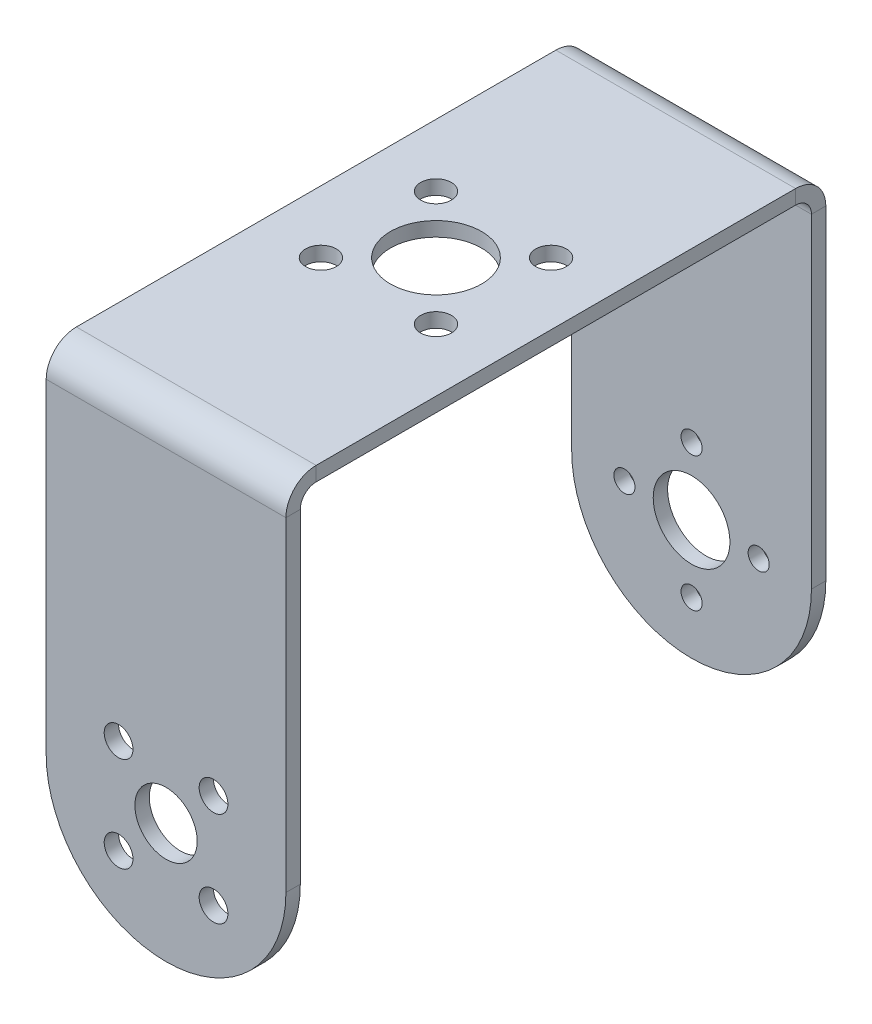
ISO-10303-21;
HEADER;
FILE_DESCRIPTION(('STEP AP214'),'2;1');
FILE_NAME('part.step','',(''),(''),'','','');
FILE_SCHEMA(('AUTOMOTIVE_DESIGN { 1 0 10303 214 1 1 1 1 }'));
ENDSEC;
DATA;
#1=APPLICATION_CONTEXT('core data for automotive mechanical design processes');
#2=APPLICATION_PROTOCOL_DEFINITION('international standard','automotive_design',2000,#1);
#3=PRODUCT_CONTEXT('',#1,'mechanical');
#4=PRODUCT('Part','Part','',(#3));
#5=PRODUCT_RELATED_PRODUCT_CATEGORY('part','',(#4));
#6=PRODUCT_DEFINITION_FORMATION('','',#4);
#7=PRODUCT_DEFINITION_CONTEXT('part definition',#1,'design');
#8=PRODUCT_DEFINITION('design','',#6,#7);
#9=PRODUCT_DEFINITION_SHAPE('','',#8);
#10=(LENGTH_UNIT() NAMED_UNIT(*) SI_UNIT(.MILLI.,.METRE.));
#11=(NAMED_UNIT(*) PLANE_ANGLE_UNIT() SI_UNIT($,.RADIAN.));
#12=(NAMED_UNIT(*) SI_UNIT($,.STERADIAN.) SOLID_ANGLE_UNIT());
#13=UNCERTAINTY_MEASURE_WITH_UNIT(LENGTH_MEASURE(1.E-05),#10,'distance_accuracy_value','');
#14=(GEOMETRIC_REPRESENTATION_CONTEXT(3) GLOBAL_UNCERTAINTY_ASSIGNED_CONTEXT((#13)) GLOBAL_UNIT_ASSIGNED_CONTEXT((#10,
#11,#12)) REPRESENTATION_CONTEXT('',''));
#15=CARTESIAN_POINT('',(0.,0.,0.));
#16=DIRECTION('',(0.,0.,1.));
#17=DIRECTION('',(1.,0.,0.));
#18=AXIS2_PLACEMENT_3D('',#15,#16,#17);
#19=CARTESIAN_POINT('',(0.,-1.5,0.));
#20=DIRECTION('',(0.,1.,0.));
#21=DIRECTION('',(0.,0.,1.));
#22=AXIS2_PLACEMENT_3D('',#19,#20,#21);
#23=PLANE('',#22);
#24=CARTESIAN_POINT('',(0.,-1.5,0.));
#25=DIRECTION('',(0.,1.,0.));
#26=DIRECTION('',(0.,0.,1.));
#27=AXIS2_PLACEMENT_3D('',#24,#25,#26);
#28=CIRCLE('',#27,4.75);
#29=CARTESIAN_POINT('',(0.,-1.5,4.75));
#30=VERTEX_POINT('',#29);
#31=EDGE_CURVE('E965',#30,#30,#28,.T.);
#32=ORIENTED_EDGE('',*,*,#31,.T.);
#33=EDGE_LOOP('',(#32));
#34=FACE_BOUND('',#33,.T.);
#35=CARTESIAN_POINT('',(-6.,-1.5,6.));
#36=DIRECTION('',(0.,1.,0.));
#37=DIRECTION('',(0.,0.,1.));
#38=AXIS2_PLACEMENT_3D('',#35,#36,#37);
#39=CIRCLE('',#38,1.6);
#40=CARTESIAN_POINT('',(-6.,-1.5,7.6));
#41=VERTEX_POINT('',#40);
#42=EDGE_CURVE('E343',#41,#41,#39,.T.);
#43=ORIENTED_EDGE('',*,*,#42,.T.);
#44=EDGE_LOOP('',(#43));
#45=FACE_BOUND('',#44,.T.);
#46=CARTESIAN_POINT('',(6.,-1.5,6.));
#47=DIRECTION('',(0.,1.,0.));
#48=DIRECTION('',(0.,0.,1.));
#49=AXIS2_PLACEMENT_3D('',#46,#47,#48);
#50=CIRCLE('',#49,1.6);
#51=CARTESIAN_POINT('',(6.,-1.5,7.6));
#52=VERTEX_POINT('',#51);
#53=EDGE_CURVE('E351',#52,#52,#50,.T.);
#54=ORIENTED_EDGE('',*,*,#53,.T.);
#55=EDGE_LOOP('',(#54));
#56=FACE_BOUND('',#55,.T.);
#57=CARTESIAN_POINT('',(6.,-1.5,-6.));
#58=DIRECTION('',(0.,1.,0.));
#59=DIRECTION('',(0.,0.,1.));
#60=AXIS2_PLACEMENT_3D('',#57,#58,#59);
#61=CIRCLE('',#60,1.6);
#62=CARTESIAN_POINT('',(6.,-1.5,-4.4));
#63=VERTEX_POINT('',#62);
#64=EDGE_CURVE('E359',#63,#63,#61,.T.);
#65=ORIENTED_EDGE('',*,*,#64,.T.);
#66=EDGE_LOOP('',(#65));
#67=FACE_BOUND('',#66,.T.);
#68=CARTESIAN_POINT('',(-6.,-1.5,-6.));
#69=DIRECTION('',(0.,1.,0.));
#70=DIRECTION('',(0.,0.,1.));
#71=AXIS2_PLACEMENT_3D('',#68,#69,#70);
#72=CIRCLE('',#71,1.6);
#73=CARTESIAN_POINT('',(-6.,-1.5,-4.4));
#74=VERTEX_POINT('',#73);
#75=EDGE_CURVE('E987',#74,#74,#72,.T.);
#76=ORIENTED_EDGE('',*,*,#75,.T.);
#77=EDGE_LOOP('',(#76));
#78=FACE_BOUND('',#77,.T.);
#79=DIRECTION('',(1.,0.,0.));
#80=VECTOR('',#79,1.);
#81=CARTESIAN_POINT('',(12.5,-1.50000000000001,-25.));
#82=LINE('',#81,#80);
#83=CARTESIAN_POINT('',(12.5,-1.50000000000001,-25.));
#84=VERTEX_POINT('',#83);
#85=CARTESIAN_POINT('',(-12.5,-1.50000000000001,-25.));
#86=VERTEX_POINT('',#85);
#87=EDGE_CURVE('E210',#84,#86,#82,.F.);
#88=ORIENTED_EDGE('',*,*,#87,.F.);
#89=DIRECTION('',(0.,0.,-1.));
#90=VECTOR('',#89,1.);
#91=CARTESIAN_POINT('',(12.5,-1.5,26.65));
#92=LINE('',#91,#90);
#93=CARTESIAN_POINT('',(12.5,-1.5,25.));
#94=VERTEX_POINT('',#93);
#95=EDGE_CURVE('E286',#94,#84,#92,.T.);
#96=ORIENTED_EDGE('',*,*,#95,.F.);
#97=DIRECTION('',(-1.,0.,0.));
#98=VECTOR('',#97,1.);
#99=CARTESIAN_POINT('',(-12.5,-1.5,25.));
#100=LINE('',#99,#98);
#101=CARTESIAN_POINT('',(-12.5,-1.5,25.));
#102=VERTEX_POINT('',#101);
#103=EDGE_CURVE('E268',#102,#94,#100,.F.);
#104=ORIENTED_EDGE('',*,*,#103,.F.);
#105=DIRECTION('',(0.,0.,1.));
#106=VECTOR('',#105,1.);
#107=CARTESIAN_POINT('',(-12.5,-1.5,26.65));
#108=LINE('',#107,#106);
#109=EDGE_CURVE('E282',#86,#102,#108,.T.);
#110=ORIENTED_EDGE('',*,*,#109,.F.);
#111=EDGE_LOOP('',(#88,#96,#104,#110));
#112=FACE_BOUND('',#111,.T.);
#113=ADVANCED_FACE('F53',(#34,#45,#56,#67,#78,#112),#23,.F.);
#114=CARTESIAN_POINT('',(0.,0.,0.));
#115=DIRECTION('',(0.,1.,0.));
#116=DIRECTION('',(0.,0.,1.));
#117=AXIS2_PLACEMENT_3D('',#114,#115,#116);
#118=PLANE('',#117);
#119=CARTESIAN_POINT('',(0.,0.,0.));
#120=DIRECTION('',(0.,1.,0.));
#121=DIRECTION('',(0.,0.,1.));
#122=AXIS2_PLACEMENT_3D('',#119,#120,#121);
#123=CIRCLE('',#122,4.75);
#124=CARTESIAN_POINT('',(0.,0.,4.75));
#125=VERTEX_POINT('',#124);
#126=EDGE_CURVE('E963',#125,#125,#123,.T.);
#127=ORIENTED_EDGE('',*,*,#126,.F.);
#128=EDGE_LOOP('',(#127));
#129=FACE_BOUND('',#128,.T.);
#130=CARTESIAN_POINT('',(-6.,0.,6.));
#131=DIRECTION('',(0.,1.,0.));
#132=DIRECTION('',(0.,0.,1.));
#133=AXIS2_PLACEMENT_3D('',#130,#131,#132);
#134=CIRCLE('',#133,1.6);
#135=CARTESIAN_POINT('',(-6.,0.,7.6));
#136=VERTEX_POINT('',#135);
#137=EDGE_CURVE('E967',#136,#136,#134,.T.);
#138=ORIENTED_EDGE('',*,*,#137,.F.);
#139=EDGE_LOOP('',(#138));
#140=FACE_BOUND('',#139,.T.);
#141=CARTESIAN_POINT('',(6.,0.,6.));
#142=DIRECTION('',(0.,1.,0.));
#143=DIRECTION('',(0.,0.,1.));
#144=AXIS2_PLACEMENT_3D('',#141,#142,#143);
#145=CIRCLE('',#144,1.6);
#146=CARTESIAN_POINT('',(6.,0.,7.6));
#147=VERTEX_POINT('',#146);
#148=EDGE_CURVE('E972',#147,#147,#145,.T.);
#149=ORIENTED_EDGE('',*,*,#148,.F.);
#150=EDGE_LOOP('',(#149));
#151=FACE_BOUND('',#150,.T.);
#152=CARTESIAN_POINT('',(6.,0.,-6.));
#153=DIRECTION('',(0.,1.,0.));
#154=DIRECTION('',(0.,0.,1.));
#155=AXIS2_PLACEMENT_3D('',#152,#153,#154);
#156=CIRCLE('',#155,1.6);
#157=CARTESIAN_POINT('',(6.,0.,-4.4));
#158=VERTEX_POINT('',#157);
#159=EDGE_CURVE('E977',#158,#158,#156,.T.);
#160=ORIENTED_EDGE('',*,*,#159,.F.);
#161=EDGE_LOOP('',(#160));
#162=FACE_BOUND('',#161,.T.);
#163=CARTESIAN_POINT('',(-6.,0.,-6.));
#164=DIRECTION('',(0.,1.,0.));
#165=DIRECTION('',(0.,0.,1.));
#166=AXIS2_PLACEMENT_3D('',#163,#164,#165);
#167=CIRCLE('',#166,1.6);
#168=CARTESIAN_POINT('',(-6.,0.,-4.4));
#169=VERTEX_POINT('',#168);
#170=EDGE_CURVE('E981',#169,#169,#167,.T.);
#171=ORIENTED_EDGE('',*,*,#170,.F.);
#172=EDGE_LOOP('',(#171));
#173=FACE_BOUND('',#172,.T.);
#174=DIRECTION('',(0.,0.,-1.));
#175=VECTOR('',#174,1.);
#176=CARTESIAN_POINT('',(12.5,0.,26.65));
#177=LINE('',#176,#175);
#178=CARTESIAN_POINT('',(12.5,0.,25.));
#179=VERTEX_POINT('',#178);
#180=CARTESIAN_POINT('',(12.5,0.,-25.));
#181=VERTEX_POINT('',#180);
#182=EDGE_CURVE('E287',#179,#181,#177,.T.);
#183=ORIENTED_EDGE('',*,*,#182,.T.);
#184=DIRECTION('',(1.,0.,0.));
#185=VECTOR('',#184,1.);
#186=CARTESIAN_POINT('',(12.5,0.,-25.));
#187=LINE('',#186,#185);
#188=CARTESIAN_POINT('',(-12.5,0.,-25.));
#189=VERTEX_POINT('',#188);
#190=EDGE_CURVE('E164',#181,#189,#187,.F.);
#191=ORIENTED_EDGE('',*,*,#190,.T.);
#192=DIRECTION('',(0.,0.,1.));
#193=VECTOR('',#192,1.);
#194=CARTESIAN_POINT('',(-12.5,0.,26.65));
#195=LINE('',#194,#193);
#196=CARTESIAN_POINT('',(-12.5,0.,25.));
#197=VERTEX_POINT('',#196);
#198=EDGE_CURVE('E278',#189,#197,#195,.T.);
#199=ORIENTED_EDGE('',*,*,#198,.T.);
#200=DIRECTION('',(-1.,0.,0.));
#201=VECTOR('',#200,1.);
#202=CARTESIAN_POINT('',(-12.5,0.,25.));
#203=LINE('',#202,#201);
#204=EDGE_CURVE('E251',#197,#179,#203,.F.);
#205=ORIENTED_EDGE('',*,*,#204,.T.);
#206=EDGE_LOOP('',(#183,#191,#199,#205));
#207=FACE_BOUND('',#206,.T.);
#208=ADVANCED_FACE('F469',(#129,#140,#151,#162,#173,#207),#118,.T.);
#209=CARTESIAN_POINT('',(12.5,-1.5,26.65));
#210=DIRECTION('',(1.,0.,0.));
#211=DIRECTION('',(0.,0.,-1.));
#212=AXIS2_PLACEMENT_3D('',#209,#210,#211);
#213=PLANE('',#212);
#214=ORIENTED_EDGE('',*,*,#95,.T.);
#215=DIRECTION('',(0.,1.,0.));
#216=VECTOR('',#215,1.);
#217=CARTESIAN_POINT('',(12.5,-1.50000000000001,-25.));
#218=LINE('',#217,#216);
#219=EDGE_CURVE('E206',#84,#181,#218,.T.);
#220=ORIENTED_EDGE('',*,*,#219,.T.);
#221=ORIENTED_EDGE('',*,*,#182,.F.);
#222=DIRECTION('',(0.,1.,0.));
#223=VECTOR('',#222,1.);
#224=CARTESIAN_POINT('',(12.5,-1.5,25.));
#225=LINE('',#224,#223);
#226=EDGE_CURVE('E274',#94,#179,#225,.T.);
#227=ORIENTED_EDGE('',*,*,#226,.F.);
#228=EDGE_LOOP('',(#214,#220,#221,#227));
#229=FACE_BOUND('',#228,.T.);
#230=ADVANCED_FACE('F474',(#229),#213,.T.);
#231=CARTESIAN_POINT('',(-12.5,-1.5,26.65));
#232=DIRECTION('',(-1.,0.,0.));
#233=DIRECTION('',(0.,0.,1.));
#234=AXIS2_PLACEMENT_3D('',#231,#232,#233);
#235=PLANE('',#234);
#236=DIRECTION('',(0.,1.,0.));
#237=VECTOR('',#236,1.);
#238=CARTESIAN_POINT('',(-12.5,-1.50000000000001,-25.));
#239=LINE('',#238,#237);
#240=EDGE_CURVE('E215',#86,#189,#239,.T.);
#241=ORIENTED_EDGE('',*,*,#240,.F.);
#242=ORIENTED_EDGE('',*,*,#109,.T.);
#243=DIRECTION('',(0.,1.,0.));
#244=VECTOR('',#243,1.);
#245=CARTESIAN_POINT('',(-12.5,-1.5,25.));
#246=LINE('',#245,#244);
#247=EDGE_CURVE('E260',#102,#197,#246,.T.);
#248=ORIENTED_EDGE('',*,*,#247,.T.);
#249=ORIENTED_EDGE('',*,*,#198,.F.);
#250=EDGE_LOOP('',(#241,#242,#248,#249));
#251=FACE_BOUND('',#250,.T.);
#252=ADVANCED_FACE('F484',(#251),#235,.T.);
#253=CARTESIAN_POINT('',(12.5,-3.15,25.));
#254=DIRECTION('',(1.,0.,0.));
#255=DIRECTION('',(0.,0.,-1.));
#256=AXIS2_PLACEMENT_3D('',#253,#254,#255);
#257=PLANE('',#256);
#258=DIRECTION('',(0.,0.,1.));
#259=VECTOR('',#258,1.);
#260=CARTESIAN_POINT('',(12.5,-3.15,26.65));
#261=LINE('',#260,#259);
#262=CARTESIAN_POINT('',(12.5,-3.14999999999999,26.65));
#263=VERTEX_POINT('',#262);
#264=CARTESIAN_POINT('',(12.5,-3.14999999999999,28.15));
#265=VERTEX_POINT('',#264);
#266=EDGE_CURVE('E219',#263,#265,#261,.T.);
#267=ORIENTED_EDGE('',*,*,#266,.F.);
#268=CARTESIAN_POINT('',(12.5,-3.15,25.));
#269=DIRECTION('',(-1.,0.,0.));
#270=DIRECTION('',(0.,0.,1.));
#271=AXIS2_PLACEMENT_3D('',#268,#269,#270);
#272=CIRCLE('',#271,1.65);
#273=EDGE_CURVE('E264',#94,#263,#272,.F.);
#274=ORIENTED_EDGE('',*,*,#273,.F.);
#275=ORIENTED_EDGE('',*,*,#226,.T.);
#276=CARTESIAN_POINT('',(12.5,-3.15,25.));
#277=DIRECTION('',(-1.,0.,0.));
#278=DIRECTION('',(0.,0.,1.));
#279=AXIS2_PLACEMENT_3D('',#276,#277,#278);
#280=CIRCLE('',#279,3.15);
#281=EDGE_CURVE('E255',#179,#265,#280,.F.);
#282=ORIENTED_EDGE('',*,*,#281,.T.);
#283=EDGE_LOOP('',(#267,#274,#275,#282));
#284=FACE_BOUND('',#283,.T.);
#285=ADVANCED_FACE('F488',(#284),#257,.T.);
#286=CARTESIAN_POINT('',(-12.5,-3.15,25.));
#287=DIRECTION('',(1.,0.,0.));
#288=DIRECTION('',(0.,0.,-1.));
#289=AXIS2_PLACEMENT_3D('',#286,#287,#288);
#290=PLANE('',#289);
#291=CARTESIAN_POINT('',(-12.5,-3.15,25.));
#292=DIRECTION('',(-1.,0.,0.));
#293=DIRECTION('',(0.,0.,1.));
#294=AXIS2_PLACEMENT_3D('',#291,#292,#293);
#295=CIRCLE('',#294,1.65);
#296=CARTESIAN_POINT('',(-12.5,-3.14999999999999,26.65));
#297=VERTEX_POINT('',#296);
#298=EDGE_CURVE('E245',#297,#102,#295,.T.);
#299=ORIENTED_EDGE('',*,*,#298,.F.);
#300=DIRECTION('',(0.,0.,1.));
#301=VECTOR('',#300,1.);
#302=CARTESIAN_POINT('',(-12.5,-3.15,26.65));
#303=LINE('',#302,#301);
#304=CARTESIAN_POINT('',(-12.5,-3.15,28.15));
#305=VERTEX_POINT('',#304);
#306=EDGE_CURVE('E225',#297,#305,#303,.T.);
#307=ORIENTED_EDGE('',*,*,#306,.T.);
#308=CARTESIAN_POINT('',(-12.5,-3.15,25.));
#309=DIRECTION('',(-1.,0.,0.));
#310=DIRECTION('',(0.,0.,1.));
#311=AXIS2_PLACEMENT_3D('',#308,#309,#310);
#312=CIRCLE('',#311,3.15);
#313=EDGE_CURVE('E256',#305,#197,#312,.T.);
#314=ORIENTED_EDGE('',*,*,#313,.T.);
#315=ORIENTED_EDGE('',*,*,#247,.F.);
#316=EDGE_LOOP('',(#299,#307,#314,#315));
#317=FACE_BOUND('',#316,.T.);
#318=ADVANCED_FACE('F479',(#317),#290,.F.);
#319=CARTESIAN_POINT('',(-12.5,-3.15,25.));
#320=DIRECTION('',(-1.,0.,0.));
#321=DIRECTION('',(0.,0.,1.));
#322=AXIS2_PLACEMENT_3D('',#319,#320,#321);
#323=CYLINDRICAL_SURFACE('',#322,3.15);
#324=ORIENTED_EDGE('',*,*,#204,.F.);
#325=ORIENTED_EDGE('',*,*,#313,.F.);
#326=DIRECTION('',(1.,0.,0.));
#327=VECTOR('',#326,1.);
#328=CARTESIAN_POINT('',(0.,-3.15,28.15));
#329=LINE('',#328,#327);
#330=EDGE_CURVE('E229',#305,#265,#329,.T.);
#331=ORIENTED_EDGE('',*,*,#330,.T.);
#332=ORIENTED_EDGE('',*,*,#281,.F.);
#333=EDGE_LOOP('',(#324,#325,#331,#332));
#334=FACE_BOUND('',#333,.T.);
#335=ADVANCED_FACE('F529',(#334),#323,.T.);
#336=CARTESIAN_POINT('',(-12.5,-3.15,25.));
#337=DIRECTION('',(-1.,0.,0.));
#338=DIRECTION('',(0.,0.,1.));
#339=AXIS2_PLACEMENT_3D('',#336,#337,#338);
#340=CYLINDRICAL_SURFACE('',#339,1.65);
#341=ORIENTED_EDGE('',*,*,#103,.T.);
#342=ORIENTED_EDGE('',*,*,#273,.T.);
#343=DIRECTION('',(-1.,0.,0.));
#344=VECTOR('',#343,1.);
#345=CARTESIAN_POINT('',(12.5,-3.15,26.65));
#346=LINE('',#345,#344);
#347=EDGE_CURVE('E222',#263,#297,#346,.T.);
#348=ORIENTED_EDGE('',*,*,#347,.T.);
#349=ORIENTED_EDGE('',*,*,#298,.T.);
#350=EDGE_LOOP('',(#341,#342,#348,#349));
#351=FACE_BOUND('',#350,.T.);
#352=ADVANCED_FACE('F517',(#351),#340,.F.);
#353=CARTESIAN_POINT('',(-12.5,-49.5,28.1500000000002));
#354=DIRECTION('',(1.,0.,0.));
#355=DIRECTION('',(0.,1.,0.));
#356=AXIS2_PLACEMENT_3D('',#353,#354,#355);
#357=PLANE('',#356);
#358=DIRECTION('',(0.,-1.,0.));
#359=VECTOR('',#358,1.);
#360=CARTESIAN_POINT('',(-12.5,-49.5,26.6500000000002));
#361=LINE('',#360,#359);
#362=CARTESIAN_POINT('',(-12.5,-37.,26.6500000000001));
#363=VERTEX_POINT('',#362);
#364=EDGE_CURVE('E236',#297,#363,#361,.T.);
#365=ORIENTED_EDGE('',*,*,#364,.T.);
#366=DIRECTION('',(0.,0.,-1.));
#367=VECTOR('',#366,1.);
#368=CARTESIAN_POINT('',(-12.5,-37.,28.1500000000001));
#369=LINE('',#368,#367);
#370=CARTESIAN_POINT('',(-12.5,-37.,28.1500000000001));
#371=VERTEX_POINT('',#370);
#372=EDGE_CURVE('E313',#363,#371,#369,.F.);
#373=ORIENTED_EDGE('',*,*,#372,.T.);
#374=DIRECTION('',(0.,-1.,0.));
#375=VECTOR('',#374,1.);
#376=CARTESIAN_POINT('',(-12.5,-49.5,28.1500000000002));
#377=LINE('',#376,#375);
#378=EDGE_CURVE('E237',#305,#371,#377,.T.);
#379=ORIENTED_EDGE('',*,*,#378,.F.);
#380=ORIENTED_EDGE('',*,*,#306,.F.);
#381=EDGE_LOOP('',(#365,#373,#379,#380));
#382=FACE_BOUND('',#381,.T.);
#383=ADVANCED_FACE('F525',(#382),#357,.F.);
#384=CARTESIAN_POINT('',(12.5,-1.49999999999999,28.15));
#385=DIRECTION('',(-1.,0.,0.));
#386=DIRECTION('',(0.,0.,1.));
#387=AXIS2_PLACEMENT_3D('',#384,#385,#386);
#388=PLANE('',#387);
#389=DIRECTION('',(0.,1.,0.));
#390=VECTOR('',#389,1.);
#391=CARTESIAN_POINT('',(12.5,-1.49999999999999,28.15));
#392=LINE('',#391,#390);
#393=CARTESIAN_POINT('',(12.5,-37.,28.1500000000001));
#394=VERTEX_POINT('',#393);
#395=EDGE_CURVE('E241',#394,#265,#392,.T.);
#396=ORIENTED_EDGE('',*,*,#395,.F.);
#397=DIRECTION('',(0.,0.,-1.));
#398=VECTOR('',#397,1.);
#399=CARTESIAN_POINT('',(12.5,-37.,28.1500000000001));
#400=LINE('',#399,#398);
#401=CARTESIAN_POINT('',(12.5,-37.,26.6500000000001));
#402=VERTEX_POINT('',#401);
#403=EDGE_CURVE('E291',#394,#402,#400,.T.);
#404=ORIENTED_EDGE('',*,*,#403,.T.);
#405=DIRECTION('',(0.,1.,0.));
#406=VECTOR('',#405,1.);
#407=CARTESIAN_POINT('',(12.5,-1.5,26.65));
#408=LINE('',#407,#406);
#409=EDGE_CURVE('E242',#402,#263,#408,.T.);
#410=ORIENTED_EDGE('',*,*,#409,.T.);
#411=ORIENTED_EDGE('',*,*,#266,.T.);
#412=EDGE_LOOP('',(#396,#404,#410,#411));
#413=FACE_BOUND('',#412,.T.);
#414=ADVANCED_FACE('F509',(#413),#388,.F.);
#415=CARTESIAN_POINT('',(0.,0.,28.15));
#416=DIRECTION('',(0.,0.,-1.));
#417=DIRECTION('',(0.,1.,0.));
#418=AXIS2_PLACEMENT_3D('',#415,#416,#417);
#419=PLANE('',#418);
#420=CARTESIAN_POINT('',(4.94974746830584,-32.0502525316942,28.15));
#421=DIRECTION('',(0.,0.,1.));
#422=DIRECTION('',(1.,0.,0.));
#423=AXIS2_PLACEMENT_3D('',#420,#421,#422);
#424=CIRCLE('',#423,1.5);
#425=CARTESIAN_POINT('',(6.44974746830584,-32.0502525316942,28.15));
#426=VERTEX_POINT('',#425);
#427=EDGE_CURVE('E412',#426,#426,#424,.T.);
#428=ORIENTED_EDGE('',*,*,#427,.F.);
#429=EDGE_LOOP('',(#428));
#430=FACE_BOUND('',#429,.T.);
#431=CARTESIAN_POINT('',(-4.94974746830583,-41.9497474683058,28.15));
#432=DIRECTION('',(0.,0.,1.));
#433=DIRECTION('',(1.,0.,0.));
#434=AXIS2_PLACEMENT_3D('',#431,#432,#433);
#435=CIRCLE('',#434,1.5);
#436=CARTESIAN_POINT('',(-3.44974746830583,-41.9497474683058,28.15));
#437=VERTEX_POINT('',#436);
#438=EDGE_CURVE('E405',#437,#437,#435,.T.);
#439=ORIENTED_EDGE('',*,*,#438,.F.);
#440=EDGE_LOOP('',(#439));
#441=FACE_BOUND('',#440,.T.);
#442=CARTESIAN_POINT('',(4.94974746830584,-41.9497474683058,28.15));
#443=DIRECTION('',(0.,0.,1.));
#444=DIRECTION('',(1.,0.,0.));
#445=AXIS2_PLACEMENT_3D('',#442,#443,#444);
#446=CIRCLE('',#445,1.5);
#447=CARTESIAN_POINT('',(6.44974746830584,-41.9497474683058,28.15));
#448=VERTEX_POINT('',#447);
#449=EDGE_CURVE('E396',#448,#448,#446,.T.);
#450=ORIENTED_EDGE('',*,*,#449,.F.);
#451=EDGE_LOOP('',(#450));
#452=FACE_BOUND('',#451,.T.);
#453=CARTESIAN_POINT('',(0.,-37.,28.15));
#454=DIRECTION('',(0.,0.,1.));
#455=DIRECTION('',(1.,0.,0.));
#456=AXIS2_PLACEMENT_3D('',#453,#454,#455);
#457=CIRCLE('',#456,3.25);
#458=CARTESIAN_POINT('',(3.25000000000001,-37.,28.15));
#459=VERTEX_POINT('',#458);
#460=EDGE_CURVE('E392',#459,#459,#457,.T.);
#461=ORIENTED_EDGE('',*,*,#460,.F.);
#462=EDGE_LOOP('',(#461));
#463=FACE_BOUND('',#462,.T.);
#464=CARTESIAN_POINT('',(-4.94974746830583,-32.0502525316942,28.15));
#465=DIRECTION('',(0.,0.,1.));
#466=DIRECTION('',(1.,0.,0.));
#467=AXIS2_PLACEMENT_3D('',#464,#465,#466);
#468=CIRCLE('',#467,1.5);
#469=CARTESIAN_POINT('',(-3.44974746830583,-32.0502525316942,28.15));
#470=VERTEX_POINT('',#469);
#471=EDGE_CURVE('E431',#470,#470,#468,.T.);
#472=ORIENTED_EDGE('',*,*,#471,.F.);
#473=EDGE_LOOP('',(#472));
#474=FACE_BOUND('',#473,.T.);
#475=CARTESIAN_POINT('',(0.,-37.,28.1500000000001));
#476=DIRECTION('',(0.,0.,-1.));
#477=DIRECTION('',(0.,1.,0.));
#478=AXIS2_PLACEMENT_3D('',#475,#476,#477);
#479=CIRCLE('',#478,12.5);
#480=CARTESIAN_POINT('',(0.,-49.5,28.1500000000002));
#481=VERTEX_POINT('',#480);
#482=EDGE_CURVE('E307',#371,#481,#479,.F.);
#483=ORIENTED_EDGE('',*,*,#482,.T.);
#484=CARTESIAN_POINT('',(0.,-37.,28.1500000000001));
#485=DIRECTION('',(0.,0.,-1.));
#486=DIRECTION('',(0.,1.,0.));
#487=AXIS2_PLACEMENT_3D('',#484,#485,#486);
#488=CIRCLE('',#487,12.5);
#489=EDGE_CURVE('E310',#481,#394,#488,.F.);
#490=ORIENTED_EDGE('',*,*,#489,.T.);
#491=ORIENTED_EDGE('',*,*,#395,.T.);
#492=ORIENTED_EDGE('',*,*,#330,.F.);
#493=ORIENTED_EDGE('',*,*,#378,.T.);
#494=EDGE_LOOP('',(#483,#490,#491,#492,#493));
#495=FACE_BOUND('',#494,.T.);
#496=ADVANCED_FACE('F506',(#430,#441,#452,#463,#474,#495),#419,.F.);
#497=CARTESIAN_POINT('',(0.,0.,26.65));
#498=DIRECTION('',(0.,0.,-1.));
#499=DIRECTION('',(0.,1.,0.));
#500=AXIS2_PLACEMENT_3D('',#497,#498,#499);
#501=PLANE('',#500);
#502=CARTESIAN_POINT('',(4.94974746830584,-32.0502525316942,26.6500000000001));
#503=DIRECTION('',(0.,0.,-1.));
#504=DIRECTION('',(0.,1.,0.));
#505=AXIS2_PLACEMENT_3D('',#502,#503,#504);
#506=CIRCLE('',#505,1.5);
#507=CARTESIAN_POINT('',(4.94974746830584,-30.5502525316942,26.6500000000001));
#508=VERTEX_POINT('',#507);
#509=EDGE_CURVE('E416',#508,#508,#506,.F.);
#510=ORIENTED_EDGE('',*,*,#509,.T.);
#511=EDGE_LOOP('',(#510));
#512=FACE_BOUND('',#511,.T.);
#513=CARTESIAN_POINT('',(-4.94974746830583,-41.9497474683058,26.6500000000001));
#514=DIRECTION('',(0.,0.,-1.));
#515=DIRECTION('',(0.,1.,0.));
#516=AXIS2_PLACEMENT_3D('',#513,#514,#515);
#517=CIRCLE('',#516,1.5);
#518=CARTESIAN_POINT('',(-4.94974746830583,-40.4497474683058,26.6500000000001));
#519=VERTEX_POINT('',#518);
#520=EDGE_CURVE('E417',#519,#519,#517,.F.);
#521=ORIENTED_EDGE('',*,*,#520,.T.);
#522=EDGE_LOOP('',(#521));
#523=FACE_BOUND('',#522,.T.);
#524=CARTESIAN_POINT('',(4.94974746830584,-41.9497474683058,26.6500000000001));
#525=DIRECTION('',(0.,0.,-1.));
#526=DIRECTION('',(0.,1.,0.));
#527=AXIS2_PLACEMENT_3D('',#524,#525,#526);
#528=CIRCLE('',#527,1.5);
#529=CARTESIAN_POINT('',(4.94974746830584,-40.4497474683058,26.6500000000001));
#530=VERTEX_POINT('',#529);
#531=EDGE_CURVE('E400',#530,#530,#528,.F.);
#532=ORIENTED_EDGE('',*,*,#531,.T.);
#533=EDGE_LOOP('',(#532));
#534=FACE_BOUND('',#533,.T.);
#535=CARTESIAN_POINT('',(0.,-37.,26.6500000000001));
#536=DIRECTION('',(0.,0.,-1.));
#537=DIRECTION('',(0.,1.,0.));
#538=AXIS2_PLACEMENT_3D('',#535,#536,#537);
#539=CIRCLE('',#538,3.25);
#540=CARTESIAN_POINT('',(0.,-33.75,26.6500000000001));
#541=VERTEX_POINT('',#540);
#542=EDGE_CURVE('E401',#541,#541,#539,.F.);
#543=ORIENTED_EDGE('',*,*,#542,.T.);
#544=EDGE_LOOP('',(#543));
#545=FACE_BOUND('',#544,.T.);
#546=CARTESIAN_POINT('',(-4.94974746830583,-32.0502525316942,26.6500000000001));
#547=DIRECTION('',(0.,0.,-1.));
#548=DIRECTION('',(0.,1.,0.));
#549=AXIS2_PLACEMENT_3D('',#546,#547,#548);
#550=CIRCLE('',#549,1.5);
#551=CARTESIAN_POINT('',(-4.94974746830583,-30.5502525316942,26.6500000000001));
#552=VERTEX_POINT('',#551);
#553=EDGE_CURVE('E421',#552,#552,#550,.F.);
#554=ORIENTED_EDGE('',*,*,#553,.T.);
#555=EDGE_LOOP('',(#554));
#556=FACE_BOUND('',#555,.T.);
#557=ORIENTED_EDGE('',*,*,#409,.F.);
#558=CARTESIAN_POINT('',(0.,-37.,26.6500000000001));
#559=DIRECTION('',(0.,0.,-1.));
#560=DIRECTION('',(0.,1.,0.));
#561=AXIS2_PLACEMENT_3D('',#558,#559,#560);
#562=CIRCLE('',#561,12.5);
#563=CARTESIAN_POINT('',(0.,-49.5,26.6500000000002));
#564=VERTEX_POINT('',#563);
#565=EDGE_CURVE('E304',#402,#564,#562,.T.);
#566=ORIENTED_EDGE('',*,*,#565,.T.);
#567=CARTESIAN_POINT('',(0.,-37.,26.6500000000001));
#568=DIRECTION('',(0.,0.,-1.));
#569=DIRECTION('',(0.,1.,0.));
#570=AXIS2_PLACEMENT_3D('',#567,#568,#569);
#571=CIRCLE('',#570,12.5);
#572=EDGE_CURVE('E301',#564,#363,#571,.T.);
#573=ORIENTED_EDGE('',*,*,#572,.T.);
#574=ORIENTED_EDGE('',*,*,#364,.F.);
#575=ORIENTED_EDGE('',*,*,#347,.F.);
#576=EDGE_LOOP('',(#557,#566,#573,#574,#575));
#577=FACE_BOUND('',#576,.T.);
#578=ADVANCED_FACE('F522',(#512,#523,#534,#545,#556,#577),#501,.T.);
#579=CARTESIAN_POINT('',(-12.5,-3.15000000000001,-25.));
#580=DIRECTION('',(-1.,0.,0.));
#581=DIRECTION('',(0.,0.,1.));
#582=AXIS2_PLACEMENT_3D('',#579,#580,#581);
#583=PLANE('',#582);
#584=DIRECTION('',(0.,0.,-1.));
#585=VECTOR('',#584,1.);
#586=CARTESIAN_POINT('',(-12.5,-3.15,-26.65));
#587=LINE('',#586,#585);
#588=CARTESIAN_POINT('',(-12.5,-3.15,-26.65));
#589=VERTEX_POINT('',#588);
#590=CARTESIAN_POINT('',(-12.5,-3.15,-28.15));
#591=VERTEX_POINT('',#590);
#592=EDGE_CURVE('E435',#589,#591,#587,.T.);
#593=ORIENTED_EDGE('',*,*,#592,.F.);
#594=CARTESIAN_POINT('',(-12.5,-3.15000000000001,-25.));
#595=DIRECTION('',(1.,0.,0.));
#596=DIRECTION('',(0.,0.,-1.));
#597=AXIS2_PLACEMENT_3D('',#594,#595,#596);
#598=CIRCLE('',#597,1.65);
#599=EDGE_CURVE('E168',#86,#589,#598,.F.);
#600=ORIENTED_EDGE('',*,*,#599,.F.);
#601=ORIENTED_EDGE('',*,*,#240,.T.);
#602=CARTESIAN_POINT('',(-12.5,-3.15000000000001,-25.));
#603=DIRECTION('',(1.,0.,0.));
#604=DIRECTION('',(0.,0.,-1.));
#605=AXIS2_PLACEMENT_3D('',#602,#603,#604);
#606=CIRCLE('',#605,3.15);
#607=EDGE_CURVE('E204',#189,#591,#606,.F.);
#608=ORIENTED_EDGE('',*,*,#607,.T.);
#609=EDGE_LOOP('',(#593,#600,#601,#608));
#610=FACE_BOUND('',#609,.T.);
#611=ADVANCED_FACE('F447',(#610),#583,.T.);
#612=CARTESIAN_POINT('',(12.5,-3.15000000000001,-25.));
#613=DIRECTION('',(-1.,0.,0.));
#614=DIRECTION('',(0.,0.,1.));
#615=AXIS2_PLACEMENT_3D('',#612,#613,#614);
#616=PLANE('',#615);
#617=CARTESIAN_POINT('',(12.5,-3.15000000000001,-25.));
#618=DIRECTION('',(1.,0.,0.));
#619=DIRECTION('',(0.,0.,-1.));
#620=AXIS2_PLACEMENT_3D('',#617,#618,#619);
#621=CIRCLE('',#620,1.65);
#622=CARTESIAN_POINT('',(12.5,-3.15,-26.65));
#623=VERTEX_POINT('',#622);
#624=EDGE_CURVE('E175',#623,#84,#621,.T.);
#625=ORIENTED_EDGE('',*,*,#624,.F.);
#626=DIRECTION('',(0.,0.,-1.));
#627=VECTOR('',#626,1.);
#628=CARTESIAN_POINT('',(12.5,-3.15,-26.65));
#629=LINE('',#628,#627);
#630=CARTESIAN_POINT('',(12.5,-3.14999999999999,-28.15));
#631=VERTEX_POINT('',#630);
#632=EDGE_CURVE('E172',#623,#631,#629,.T.);
#633=ORIENTED_EDGE('',*,*,#632,.T.);
#634=CARTESIAN_POINT('',(12.5,-3.15000000000001,-25.));
#635=DIRECTION('',(1.,0.,0.));
#636=DIRECTION('',(0.,0.,-1.));
#637=AXIS2_PLACEMENT_3D('',#634,#635,#636);
#638=CIRCLE('',#637,3.15);
#639=EDGE_CURVE('E157',#631,#181,#638,.T.);
#640=ORIENTED_EDGE('',*,*,#639,.T.);
#641=ORIENTED_EDGE('',*,*,#219,.F.);
#642=EDGE_LOOP('',(#625,#633,#640,#641));
#643=FACE_BOUND('',#642,.T.);
#644=ADVANCED_FACE('F173',(#643),#616,.F.);
#645=CARTESIAN_POINT('',(12.5,-3.15000000000001,-25.));
#646=DIRECTION('',(1.,0.,0.));
#647=DIRECTION('',(0.,0.,-1.));
#648=AXIS2_PLACEMENT_3D('',#645,#646,#647);
#649=CYLINDRICAL_SURFACE('',#648,3.15);
#650=ORIENTED_EDGE('',*,*,#190,.F.);
#651=ORIENTED_EDGE('',*,*,#639,.F.);
#652=DIRECTION('',(-1.,0.,0.));
#653=VECTOR('',#652,1.);
#654=CARTESIAN_POINT('',(0.,-3.14999999999999,-28.15));
#655=LINE('',#654,#653);
#656=EDGE_CURVE('E161',#631,#591,#655,.T.);
#657=ORIENTED_EDGE('',*,*,#656,.T.);
#658=ORIENTED_EDGE('',*,*,#607,.F.);
#659=EDGE_LOOP('',(#650,#651,#657,#658));
#660=FACE_BOUND('',#659,.T.);
#661=ADVANCED_FACE('F159',(#660),#649,.T.);
#662=CARTESIAN_POINT('',(12.5,-3.15000000000001,-25.));
#663=DIRECTION('',(1.,0.,0.));
#664=DIRECTION('',(0.,0.,-1.));
#665=AXIS2_PLACEMENT_3D('',#662,#663,#664);
#666=CYLINDRICAL_SURFACE('',#665,1.65);
#667=ORIENTED_EDGE('',*,*,#87,.T.);
#668=ORIENTED_EDGE('',*,*,#599,.T.);
#669=DIRECTION('',(1.,0.,0.));
#670=VECTOR('',#669,1.);
#671=CARTESIAN_POINT('',(-12.5,-3.15,-26.65));
#672=LINE('',#671,#670);
#673=EDGE_CURVE('E178',#589,#623,#672,.T.);
#674=ORIENTED_EDGE('',*,*,#673,.T.);
#675=ORIENTED_EDGE('',*,*,#624,.T.);
#676=EDGE_LOOP('',(#667,#668,#674,#675));
#677=FACE_BOUND('',#676,.T.);
#678=ADVANCED_FACE('F451',(#677),#666,.F.);
#679=CARTESIAN_POINT('',(12.5,-49.5,-28.1500000000002));
#680=DIRECTION('',(-1.,0.,0.));
#681=DIRECTION('',(0.,0.,1.));
#682=AXIS2_PLACEMENT_3D('',#679,#680,#681);
#683=PLANE('',#682);
#684=DIRECTION('',(0.,-1.,0.));
#685=VECTOR('',#684,1.);
#686=CARTESIAN_POINT('',(12.5,-49.5,-26.6500000000002));
#687=LINE('',#686,#685);
#688=CARTESIAN_POINT('',(12.5,-37.,-26.6500000000001));
#689=VERTEX_POINT('',#688);
#690=EDGE_CURVE('E185',#623,#689,#687,.T.);
#691=ORIENTED_EDGE('',*,*,#690,.T.);
#692=DIRECTION('',(0.,0.,1.));
#693=VECTOR('',#692,1.);
#694=CARTESIAN_POINT('',(12.5,-37.,-28.1500000000001));
#695=LINE('',#694,#693);
#696=CARTESIAN_POINT('',(12.5,-37.,-28.1500000000001));
#697=VERTEX_POINT('',#696);
#698=EDGE_CURVE('E11',#689,#697,#695,.F.);
#699=ORIENTED_EDGE('',*,*,#698,.T.);
#700=DIRECTION('',(0.,-1.,0.));
#701=VECTOR('',#700,1.);
#702=CARTESIAN_POINT('',(12.5,-49.5,-28.1500000000002));
#703=LINE('',#702,#701);
#704=EDGE_CURVE('E181',#631,#697,#703,.T.);
#705=ORIENTED_EDGE('',*,*,#704,.F.);
#706=ORIENTED_EDGE('',*,*,#632,.F.);
#707=EDGE_LOOP('',(#691,#699,#705,#706));
#708=FACE_BOUND('',#707,.T.);
#709=ADVANCED_FACE('F187',(#708),#683,.F.);
#710=CARTESIAN_POINT('',(-12.5,-1.49999999999999,-28.15));
#711=DIRECTION('',(1.,0.,0.));
#712=DIRECTION('',(0.,0.,-1.));
#713=AXIS2_PLACEMENT_3D('',#710,#711,#712);
#714=PLANE('',#713);
#715=DIRECTION('',(0.,1.,0.));
#716=VECTOR('',#715,1.);
#717=CARTESIAN_POINT('',(-12.5,-1.49999999999999,-28.15));
#718=LINE('',#717,#716);
#719=CARTESIAN_POINT('',(-12.5,-37.,-28.1500000000001));
#720=VERTEX_POINT('',#719);
#721=EDGE_CURVE('E183',#720,#591,#718,.T.);
#722=ORIENTED_EDGE('',*,*,#721,.F.);
#723=DIRECTION('',(0.,0.,1.));
#724=VECTOR('',#723,1.);
#725=CARTESIAN_POINT('',(-12.5,-37.,-28.1500000000001));
#726=LINE('',#725,#724);
#727=CARTESIAN_POINT('',(-12.5,-37.,-26.6500000000001));
#728=VERTEX_POINT('',#727);
#729=EDGE_CURVE('E316',#720,#728,#726,.T.);
#730=ORIENTED_EDGE('',*,*,#729,.T.);
#731=DIRECTION('',(0.,1.,0.));
#732=VECTOR('',#731,1.);
#733=CARTESIAN_POINT('',(-12.5,-1.5,-26.65));
#734=LINE('',#733,#732);
#735=EDGE_CURVE('E189',#728,#589,#734,.T.);
#736=ORIENTED_EDGE('',*,*,#735,.T.);
#737=ORIENTED_EDGE('',*,*,#592,.T.);
#738=EDGE_LOOP('',(#722,#730,#736,#737));
#739=FACE_BOUND('',#738,.T.);
#740=ADVANCED_FACE('F442',(#739),#714,.F.);
#741=CARTESIAN_POINT('',(0.,0.,-28.15));
#742=DIRECTION('',(0.,0.,1.));
#743=DIRECTION('',(0.,-1.,0.));
#744=AXIS2_PLACEMENT_3D('',#741,#742,#743);
#745=PLANE('',#744);
#746=CARTESIAN_POINT('',(0.,-43.9999999999998,-28.1500000000002));
#747=DIRECTION('',(0.,0.,-1.));
#748=DIRECTION('',(0.,1.,0.));
#749=AXIS2_PLACEMENT_3D('',#746,#747,#748);
#750=CIRCLE('',#749,1.1);
#751=CARTESIAN_POINT('',(0.,-42.8999999999998,-28.1500000000001));
#752=VERTEX_POINT('',#751);
#753=EDGE_CURVE('E377',#752,#752,#750,.T.);
#754=ORIENTED_EDGE('',*,*,#753,.F.);
#755=EDGE_LOOP('',(#754));
#756=FACE_BOUND('',#755,.T.);
#757=CARTESIAN_POINT('',(-7.,-36.9999999999998,-28.1500000000001));
#758=DIRECTION('',(0.,0.,-1.));
#759=DIRECTION('',(0.,1.,0.));
#760=AXIS2_PLACEMENT_3D('',#757,#758,#759);
#761=CIRCLE('',#760,1.09999999999999);
#762=CARTESIAN_POINT('',(-7.,-35.8999999999998,-28.1500000000001));
#763=VERTEX_POINT('',#762);
#764=EDGE_CURVE('E366',#763,#763,#761,.T.);
#765=ORIENTED_EDGE('',*,*,#764,.F.);
#766=EDGE_LOOP('',(#765));
#767=FACE_BOUND('',#766,.T.);
#768=CARTESIAN_POINT('',(6.99999999999999,-36.9999999999998,-28.1500000000001));
#769=DIRECTION('',(0.,0.,-1.));
#770=DIRECTION('',(0.,1.,0.));
#771=AXIS2_PLACEMENT_3D('',#768,#769,#770);
#772=CIRCLE('',#771,1.1);
#773=CARTESIAN_POINT('',(6.99999999999999,-35.8999999999998,-28.1500000000001));
#774=VERTEX_POINT('',#773);
#775=EDGE_CURVE('E367',#774,#774,#772,.T.);
#776=ORIENTED_EDGE('',*,*,#775,.F.);
#777=EDGE_LOOP('',(#776));
#778=FACE_BOUND('',#777,.T.);
#779=CARTESIAN_POINT('',(0.,-29.9999999999998,-28.1500000000001));
#780=DIRECTION('',(0.,0.,-1.));
#781=DIRECTION('',(0.,1.,0.));
#782=AXIS2_PLACEMENT_3D('',#779,#780,#781);
#783=CIRCLE('',#782,1.10000000000001);
#784=CARTESIAN_POINT('',(0.,-28.8999999999998,-28.1500000000001));
#785=VERTEX_POINT('',#784);
#786=EDGE_CURVE('E332',#785,#785,#783,.T.);
#787=ORIENTED_EDGE('',*,*,#786,.F.);
#788=EDGE_LOOP('',(#787));
#789=FACE_BOUND('',#788,.T.);
#790=CARTESIAN_POINT('',(0.,-36.9999999999998,-28.1500000000001));
#791=DIRECTION('',(0.,0.,-1.));
#792=DIRECTION('',(0.,1.,0.));
#793=AXIS2_PLACEMENT_3D('',#790,#791,#792);
#794=CIRCLE('',#793,3.99999999999999);
#795=CARTESIAN_POINT('',(0.,-32.9999999999998,-28.1500000000001));
#796=VERTEX_POINT('',#795);
#797=EDGE_CURVE('E388',#796,#796,#794,.T.);
#798=ORIENTED_EDGE('',*,*,#797,.F.);
#799=EDGE_LOOP('',(#798));
#800=FACE_BOUND('',#799,.T.);
#801=CARTESIAN_POINT('',(0.,-37.,-28.1500000000001));
#802=DIRECTION('',(0.,0.,1.));
#803=DIRECTION('',(0.,-1.,0.));
#804=AXIS2_PLACEMENT_3D('',#801,#802,#803);
#805=CIRCLE('',#804,12.5);
#806=CARTESIAN_POINT('',(0.,-49.5,-28.1500000000002));
#807=VERTEX_POINT('',#806);
#808=EDGE_CURVE('E71',#697,#807,#805,.F.);
#809=ORIENTED_EDGE('',*,*,#808,.T.);
#810=CARTESIAN_POINT('',(0.,-37.,-28.1500000000001));
#811=DIRECTION('',(0.,0.,1.));
#812=DIRECTION('',(0.,-1.,0.));
#813=AXIS2_PLACEMENT_3D('',#810,#811,#812);
#814=CIRCLE('',#813,12.5);
#815=EDGE_CURVE('E63',#807,#720,#814,.F.);
#816=ORIENTED_EDGE('',*,*,#815,.T.);
#817=ORIENTED_EDGE('',*,*,#721,.T.);
#818=ORIENTED_EDGE('',*,*,#656,.F.);
#819=ORIENTED_EDGE('',*,*,#704,.T.);
#820=EDGE_LOOP('',(#809,#816,#817,#818,#819));
#821=FACE_BOUND('',#820,.T.);
#822=ADVANCED_FACE('F180',(#756,#767,#778,#789,#800,#821),#745,.F.);
#823=CARTESIAN_POINT('',(0.,0.,-26.65));
#824=DIRECTION('',(0.,0.,1.));
#825=DIRECTION('',(0.,-1.,0.));
#826=AXIS2_PLACEMENT_3D('',#823,#824,#825);
#827=PLANE('',#826);
#828=CARTESIAN_POINT('',(0.,-43.9999999999998,-26.6500000000001));
#829=DIRECTION('',(0.,0.,1.));
#830=DIRECTION('',(0.,-1.,0.));
#831=AXIS2_PLACEMENT_3D('',#828,#829,#830);
#832=CIRCLE('',#831,1.1);
#833=CARTESIAN_POINT('',(0.,-45.0999999999998,-26.6500000000002));
#834=VERTEX_POINT('',#833);
#835=EDGE_CURVE('E372',#834,#834,#832,.F.);
#836=ORIENTED_EDGE('',*,*,#835,.T.);
#837=EDGE_LOOP('',(#836));
#838=FACE_BOUND('',#837,.T.);
#839=CARTESIAN_POINT('',(-7.,-36.9999999999998,-26.6500000000001));
#840=DIRECTION('',(0.,0.,1.));
#841=DIRECTION('',(0.,-1.,0.));
#842=AXIS2_PLACEMENT_3D('',#839,#840,#841);
#843=CIRCLE('',#842,1.09999999999999);
#844=CARTESIAN_POINT('',(-7.,-38.0999999999998,-26.6500000000001));
#845=VERTEX_POINT('',#844);
#846=EDGE_CURVE('E381',#845,#845,#843,.F.);
#847=ORIENTED_EDGE('',*,*,#846,.T.);
#848=EDGE_LOOP('',(#847));
#849=FACE_BOUND('',#848,.T.);
#850=CARTESIAN_POINT('',(6.99999999999999,-36.9999999999998,-26.6500000000001));
#851=DIRECTION('',(0.,0.,1.));
#852=DIRECTION('',(0.,-1.,0.));
#853=AXIS2_PLACEMENT_3D('',#850,#851,#852);
#854=CIRCLE('',#853,1.1);
#855=CARTESIAN_POINT('',(6.99999999999999,-38.0999999999998,-26.6500000000001));
#856=VERTEX_POINT('',#855);
#857=EDGE_CURVE('E363',#856,#856,#854,.F.);
#858=ORIENTED_EDGE('',*,*,#857,.T.);
#859=EDGE_LOOP('',(#858));
#860=FACE_BOUND('',#859,.T.);
#861=CARTESIAN_POINT('',(0.,-29.9999999999998,-26.6500000000001));
#862=DIRECTION('',(0.,0.,1.));
#863=DIRECTION('',(0.,-1.,0.));
#864=AXIS2_PLACEMENT_3D('',#861,#862,#863);
#865=CIRCLE('',#864,1.10000000000001);
#866=CARTESIAN_POINT('',(0.,-31.0999999999998,-26.6500000000001));
#867=VERTEX_POINT('',#866);
#868=EDGE_CURVE('E339',#867,#867,#865,.F.);
#869=ORIENTED_EDGE('',*,*,#868,.T.);
#870=EDGE_LOOP('',(#869));
#871=FACE_BOUND('',#870,.T.);
#872=CARTESIAN_POINT('',(0.,-36.9999999999998,-26.6500000000001));
#873=DIRECTION('',(0.,0.,1.));
#874=DIRECTION('',(0.,-1.,0.));
#875=AXIS2_PLACEMENT_3D('',#872,#873,#874);
#876=CIRCLE('',#875,3.99999999999999);
#877=CARTESIAN_POINT('',(0.,-40.9999999999998,-26.6500000000001));
#878=VERTEX_POINT('',#877);
#879=EDGE_CURVE('E376',#878,#878,#876,.F.);
#880=ORIENTED_EDGE('',*,*,#879,.T.);
#881=EDGE_LOOP('',(#880));
#882=FACE_BOUND('',#881,.T.);
#883=ORIENTED_EDGE('',*,*,#735,.F.);
#884=CARTESIAN_POINT('',(0.,-37.,-26.6500000000001));
#885=DIRECTION('',(0.,0.,1.));
#886=DIRECTION('',(0.,-1.,0.));
#887=AXIS2_PLACEMENT_3D('',#884,#885,#886);
#888=CIRCLE('',#887,12.5);
#889=CARTESIAN_POINT('',(0.,-49.5,-26.6500000000002));
#890=VERTEX_POINT('',#889);
#891=EDGE_CURVE('E323',#728,#890,#888,.T.);
#892=ORIENTED_EDGE('',*,*,#891,.T.);
#893=CARTESIAN_POINT('',(0.,-37.,-26.6500000000001));
#894=DIRECTION('',(0.,0.,1.));
#895=DIRECTION('',(0.,-1.,0.));
#896=AXIS2_PLACEMENT_3D('',#893,#894,#895);
#897=CIRCLE('',#896,12.5);
#898=EDGE_CURVE('E320',#890,#689,#897,.T.);
#899=ORIENTED_EDGE('',*,*,#898,.T.);
#900=ORIENTED_EDGE('',*,*,#690,.F.);
#901=ORIENTED_EDGE('',*,*,#673,.F.);
#902=EDGE_LOOP('',(#883,#892,#899,#900,#901));
#903=FACE_BOUND('',#902,.T.);
#904=ADVANCED_FACE('F454',(#838,#849,#860,#871,#882,#903),#827,.T.);
#905=CARTESIAN_POINT('',(-4.94974746830583,-32.0502525316942,-28.1510000000002));
#906=DIRECTION('',(0.,0.,1.));
#907=DIRECTION('',(1.,0.,0.));
#908=AXIS2_PLACEMENT_3D('',#905,#906,#907);
#909=CYLINDRICAL_SURFACE('',#908,1.5);
#910=ORIENTED_EDGE('',*,*,#553,.F.);
#911=EDGE_LOOP('',(#910));
#912=FACE_BOUND('',#911,.T.);
#913=ORIENTED_EDGE('',*,*,#471,.T.);
#914=EDGE_LOOP('',(#913));
#915=FACE_BOUND('',#914,.T.);
#916=ADVANCED_FACE('F605',(#912,#915),#909,.F.);
#917=CARTESIAN_POINT('',(0.,-37.,-28.1510000000002));
#918=DIRECTION('',(0.,0.,1.));
#919=DIRECTION('',(1.,0.,0.));
#920=AXIS2_PLACEMENT_3D('',#917,#918,#919);
#921=CYLINDRICAL_SURFACE('',#920,3.25);
#922=ORIENTED_EDGE('',*,*,#542,.F.);
#923=EDGE_LOOP('',(#922));
#924=FACE_BOUND('',#923,.T.);
#925=ORIENTED_EDGE('',*,*,#460,.T.);
#926=EDGE_LOOP('',(#925));
#927=FACE_BOUND('',#926,.T.);
#928=ADVANCED_FACE('F610',(#924,#927),#921,.F.);
#929=CARTESIAN_POINT('',(4.94974746830584,-41.9497474683058,-28.1510000000002));
#930=DIRECTION('',(0.,0.,1.));
#931=DIRECTION('',(1.,0.,0.));
#932=AXIS2_PLACEMENT_3D('',#929,#930,#931);
#933=CYLINDRICAL_SURFACE('',#932,1.5);
#934=ORIENTED_EDGE('',*,*,#531,.F.);
#935=EDGE_LOOP('',(#934));
#936=FACE_BOUND('',#935,.T.);
#937=ORIENTED_EDGE('',*,*,#449,.T.);
#938=EDGE_LOOP('',(#937));
#939=FACE_BOUND('',#938,.T.);
#940=ADVANCED_FACE('F622',(#936,#939),#933,.F.);
#941=CARTESIAN_POINT('',(-4.94974746830583,-41.9497474683058,-28.1510000000002));
#942=DIRECTION('',(0.,0.,1.));
#943=DIRECTION('',(1.,0.,0.));
#944=AXIS2_PLACEMENT_3D('',#941,#942,#943);
#945=CYLINDRICAL_SURFACE('',#944,1.5);
#946=ORIENTED_EDGE('',*,*,#520,.F.);
#947=EDGE_LOOP('',(#946));
#948=FACE_BOUND('',#947,.T.);
#949=ORIENTED_EDGE('',*,*,#438,.T.);
#950=EDGE_LOOP('',(#949));
#951=FACE_BOUND('',#950,.T.);
#952=ADVANCED_FACE('F632',(#948,#951),#945,.F.);
#953=CARTESIAN_POINT('',(4.94974746830584,-32.0502525316942,-28.1510000000002));
#954=DIRECTION('',(0.,0.,1.));
#955=DIRECTION('',(1.,0.,0.));
#956=AXIS2_PLACEMENT_3D('',#953,#954,#955);
#957=CYLINDRICAL_SURFACE('',#956,1.5);
#958=ORIENTED_EDGE('',*,*,#509,.F.);
#959=EDGE_LOOP('',(#958));
#960=FACE_BOUND('',#959,.T.);
#961=ORIENTED_EDGE('',*,*,#427,.T.);
#962=EDGE_LOOP('',(#961));
#963=FACE_BOUND('',#962,.T.);
#964=ADVANCED_FACE('F642',(#960,#963),#957,.F.);
#965=CARTESIAN_POINT('',(0.,-37.,28.1510000000002));
#966=DIRECTION('',(0.,0.,-1.));
#967=DIRECTION('',(0.,1.,0.));
#968=AXIS2_PLACEMENT_3D('',#965,#966,#967);
#969=CYLINDRICAL_SURFACE('',#968,3.99999999999999);
#970=ORIENTED_EDGE('',*,*,#879,.F.);
#971=EDGE_LOOP('',(#970));
#972=FACE_BOUND('',#971,.T.);
#973=ORIENTED_EDGE('',*,*,#797,.T.);
#974=EDGE_LOOP('',(#973));
#975=FACE_BOUND('',#974,.T.);
#976=ADVANCED_FACE('F652',(#972,#975),#969,.F.);
#977=CARTESIAN_POINT('',(0.,-30.,28.1510000000002));
#978=DIRECTION('',(0.,0.,-1.));
#979=DIRECTION('',(0.,1.,0.));
#980=AXIS2_PLACEMENT_3D('',#977,#978,#979);
#981=CYLINDRICAL_SURFACE('',#980,1.10000000000001);
#982=ORIENTED_EDGE('',*,*,#868,.F.);
#983=EDGE_LOOP('',(#982));
#984=FACE_BOUND('',#983,.T.);
#985=ORIENTED_EDGE('',*,*,#786,.T.);
#986=EDGE_LOOP('',(#985));
#987=FACE_BOUND('',#986,.T.);
#988=ADVANCED_FACE('F662',(#984,#987),#981,.F.);
#989=CARTESIAN_POINT('',(6.99999999999999,-37.,28.1510000000002));
#990=DIRECTION('',(0.,0.,-1.));
#991=DIRECTION('',(0.,1.,0.));
#992=AXIS2_PLACEMENT_3D('',#989,#990,#991);
#993=CYLINDRICAL_SURFACE('',#992,1.1);
#994=ORIENTED_EDGE('',*,*,#857,.F.);
#995=EDGE_LOOP('',(#994));
#996=FACE_BOUND('',#995,.T.);
#997=ORIENTED_EDGE('',*,*,#775,.T.);
#998=EDGE_LOOP('',(#997));
#999=FACE_BOUND('',#998,.T.);
#1000=ADVANCED_FACE('F672',(#996,#999),#993,.F.);
#1001=CARTESIAN_POINT('',(-7.,-37.,28.1510000000002));
#1002=DIRECTION('',(0.,0.,-1.));
#1003=DIRECTION('',(0.,1.,0.));
#1004=AXIS2_PLACEMENT_3D('',#1001,#1002,#1003);
#1005=CYLINDRICAL_SURFACE('',#1004,1.09999999999999);
#1006=ORIENTED_EDGE('',*,*,#846,.F.);
#1007=EDGE_LOOP('',(#1006));
#1008=FACE_BOUND('',#1007,.T.);
#1009=ORIENTED_EDGE('',*,*,#764,.T.);
#1010=EDGE_LOOP('',(#1009));
#1011=FACE_BOUND('',#1010,.T.);
#1012=ADVANCED_FACE('F497',(#1008,#1011),#1005,.F.);
#1013=CARTESIAN_POINT('',(0.,-44.,28.1510000000002));
#1014=DIRECTION('',(0.,0.,-1.));
#1015=DIRECTION('',(0.,1.,0.));
#1016=AXIS2_PLACEMENT_3D('',#1013,#1014,#1015);
#1017=CYLINDRICAL_SURFACE('',#1016,1.1);
#1018=ORIENTED_EDGE('',*,*,#835,.F.);
#1019=EDGE_LOOP('',(#1018));
#1020=FACE_BOUND('',#1019,.T.);
#1021=ORIENTED_EDGE('',*,*,#753,.T.);
#1022=EDGE_LOOP('',(#1021));
#1023=FACE_BOUND('',#1022,.T.);
#1024=ADVANCED_FACE('F493',(#1020,#1023),#1017,.F.);
#1025=CARTESIAN_POINT('',(0.,-37.,28.1500000000001));
#1026=DIRECTION('',(0.,0.,-1.));
#1027=DIRECTION('',(0.,1.,0.));
#1028=AXIS2_PLACEMENT_3D('',#1025,#1026,#1027);
#1029=CYLINDRICAL_SURFACE('',#1028,12.5);
#1030=DIRECTION('',(0.,0.,-1.));
#1031=VECTOR('',#1030,1.);
#1032=CARTESIAN_POINT('',(0.,-49.5,28.1500000000002));
#1033=LINE('',#1032,#1031);
#1034=EDGE_CURVE('E329',#481,#564,#1033,.T.);
#1035=ORIENTED_EDGE('',*,*,#1034,.F.);
#1036=ORIENTED_EDGE('',*,*,#482,.F.);
#1037=ORIENTED_EDGE('',*,*,#372,.F.);
#1038=ORIENTED_EDGE('',*,*,#572,.F.);
#1039=EDGE_LOOP('',(#1035,#1036,#1037,#1038));
#1040=FACE_BOUND('',#1039,.T.);
#1041=ADVANCED_FACE('F491',(#1040),#1029,.T.);
#1042=CARTESIAN_POINT('',(0.,-37.,28.1500000000001));
#1043=DIRECTION('',(0.,0.,-1.));
#1044=DIRECTION('',(0.,1.,0.));
#1045=AXIS2_PLACEMENT_3D('',#1042,#1043,#1044);
#1046=CYLINDRICAL_SURFACE('',#1045,12.5);
#1047=ORIENTED_EDGE('',*,*,#489,.F.);
#1048=ORIENTED_EDGE('',*,*,#1034,.T.);
#1049=ORIENTED_EDGE('',*,*,#565,.F.);
#1050=ORIENTED_EDGE('',*,*,#403,.F.);
#1051=EDGE_LOOP('',(#1047,#1048,#1049,#1050));
#1052=FACE_BOUND('',#1051,.T.);
#1053=ADVANCED_FACE('F466',(#1052),#1046,.T.);
#1054=CARTESIAN_POINT('',(0.,-37.,-28.1500000000001));
#1055=DIRECTION('',(0.,0.,1.));
#1056=DIRECTION('',(0.,-1.,0.));
#1057=AXIS2_PLACEMENT_3D('',#1054,#1055,#1056);
#1058=CYLINDRICAL_SURFACE('',#1057,12.5);
#1059=DIRECTION('',(0.,0.,1.));
#1060=VECTOR('',#1059,1.);
#1061=CARTESIAN_POINT('',(0.,-49.5,-28.1500000000002));
#1062=LINE('',#1061,#1060);
#1063=EDGE_CURVE('E57',#807,#890,#1062,.T.);
#1064=ORIENTED_EDGE('',*,*,#1063,.F.);
#1065=ORIENTED_EDGE('',*,*,#808,.F.);
#1066=ORIENTED_EDGE('',*,*,#698,.F.);
#1067=ORIENTED_EDGE('',*,*,#898,.F.);
#1068=EDGE_LOOP('',(#1064,#1065,#1066,#1067));
#1069=FACE_BOUND('',#1068,.T.);
#1070=ADVANCED_FACE('F55',(#1069),#1058,.T.);
#1071=CARTESIAN_POINT('',(0.,-37.,-28.1500000000001));
#1072=DIRECTION('',(0.,0.,1.));
#1073=DIRECTION('',(0.,-1.,0.));
#1074=AXIS2_PLACEMENT_3D('',#1071,#1072,#1073);
#1075=CYLINDRICAL_SURFACE('',#1074,12.5);
#1076=ORIENTED_EDGE('',*,*,#815,.F.);
#1077=ORIENTED_EDGE('',*,*,#1063,.T.);
#1078=ORIENTED_EDGE('',*,*,#891,.F.);
#1079=ORIENTED_EDGE('',*,*,#729,.F.);
#1080=EDGE_LOOP('',(#1076,#1077,#1078,#1079));
#1081=FACE_BOUND('',#1080,.T.);
#1082=ADVANCED_FACE('F457',(#1081),#1075,.T.);
#1083=CARTESIAN_POINT('',(-6.,-49.5,-6.));
#1084=DIRECTION('',(0.,1.,0.));
#1085=DIRECTION('',(0.,0.,1.));
#1086=AXIS2_PLACEMENT_3D('',#1083,#1084,#1085);
#1087=CYLINDRICAL_SURFACE('',#1086,1.6);
#1088=ORIENTED_EDGE('',*,*,#170,.T.);
#1089=EDGE_LOOP('',(#1088));
#1090=FACE_BOUND('',#1089,.T.);
#1091=ORIENTED_EDGE('',*,*,#75,.F.);
#1092=EDGE_LOOP('',(#1091));
#1093=FACE_BOUND('',#1092,.T.);
#1094=ADVANCED_FACE('F459',(#1090,#1093),#1087,.F.);
#1095=CARTESIAN_POINT('',(6.,-49.5,-6.));
#1096=DIRECTION('',(0.,1.,0.));
#1097=DIRECTION('',(0.,0.,1.));
#1098=AXIS2_PLACEMENT_3D('',#1095,#1096,#1097);
#1099=CYLINDRICAL_SURFACE('',#1098,1.6);
#1100=ORIENTED_EDGE('',*,*,#159,.T.);
#1101=EDGE_LOOP('',(#1100));
#1102=FACE_BOUND('',#1101,.T.);
#1103=ORIENTED_EDGE('',*,*,#64,.F.);
#1104=EDGE_LOOP('',(#1103));
#1105=FACE_BOUND('',#1104,.T.);
#1106=ADVANCED_FACE('F463',(#1102,#1105),#1099,.F.);
#1107=CARTESIAN_POINT('',(6.,-49.5,6.));
#1108=DIRECTION('',(0.,1.,0.));
#1109=DIRECTION('',(0.,0.,1.));
#1110=AXIS2_PLACEMENT_3D('',#1107,#1108,#1109);
#1111=CYLINDRICAL_SURFACE('',#1110,1.6);
#1112=ORIENTED_EDGE('',*,*,#148,.T.);
#1113=EDGE_LOOP('',(#1112));
#1114=FACE_BOUND('',#1113,.T.);
#1115=ORIENTED_EDGE('',*,*,#53,.F.);
#1116=EDGE_LOOP('',(#1115));
#1117=FACE_BOUND('',#1116,.T.);
#1118=ADVANCED_FACE('F792',(#1114,#1117),#1111,.F.);
#1119=CARTESIAN_POINT('',(-6.,-49.5,6.));
#1120=DIRECTION('',(0.,1.,0.));
#1121=DIRECTION('',(0.,0.,1.));
#1122=AXIS2_PLACEMENT_3D('',#1119,#1120,#1121);
#1123=CYLINDRICAL_SURFACE('',#1122,1.6);
#1124=ORIENTED_EDGE('',*,*,#137,.T.);
#1125=EDGE_LOOP('',(#1124));
#1126=FACE_BOUND('',#1125,.T.);
#1127=ORIENTED_EDGE('',*,*,#42,.F.);
#1128=EDGE_LOOP('',(#1127));
#1129=FACE_BOUND('',#1128,.T.);
#1130=ADVANCED_FACE('F802',(#1126,#1129),#1123,.F.);
#1131=CARTESIAN_POINT('',(0.,-49.5,0.));
#1132=DIRECTION('',(0.,1.,0.));
#1133=DIRECTION('',(0.,0.,1.));
#1134=AXIS2_PLACEMENT_3D('',#1131,#1132,#1133);
#1135=CYLINDRICAL_SURFACE('',#1134,4.75);
#1136=ORIENTED_EDGE('',*,*,#126,.T.);
#1137=EDGE_LOOP('',(#1136));
#1138=FACE_BOUND('',#1137,.T.);
#1139=ORIENTED_EDGE('',*,*,#31,.F.);
#1140=EDGE_LOOP('',(#1139));
#1141=FACE_BOUND('',#1140,.T.);
#1142=ADVANCED_FACE('F811',(#1138,#1141),#1135,.F.);
#1143=CLOSED_SHELL('',(#113,#208,#230,#252,#285,#318,#335,#352,#383,#414,#496,#578,#611,#644,
#661,#678,#709,#740,#822,#904,#916,#928,#940,#952,#964,#976,#988,#1000,#1012,#1024,#1041,#1053,
#1070,#1082,#1094,#1106,#1118,#1130,#1142));
#1144=MANIFOLD_SOLID_BREP('B2',#1143);
#1145=ADVANCED_BREP_SHAPE_REPRESENTATION('',(#18,#1144),#14);
#1146=SHAPE_DEFINITION_REPRESENTATION(#9,#1145);
ENDSEC;
END-ISO-10303-21;
